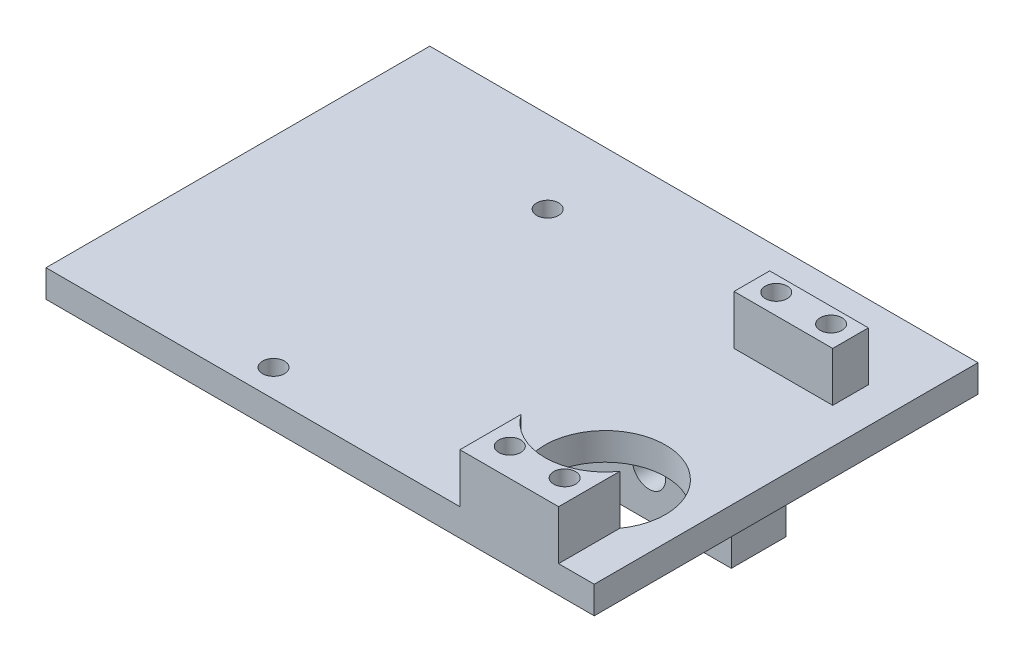
ISO-10303-21;
HEADER;
FILE_DESCRIPTION(('STEP AP214'),'2;1');
FILE_NAME('part.step','',(''),(''),'','','');
FILE_SCHEMA(('AUTOMOTIVE_DESIGN { 1 0 10303 214 1 1 1 1 }'));
ENDSEC;
DATA;
#1=APPLICATION_CONTEXT('core data for automotive mechanical design processes');
#2=APPLICATION_PROTOCOL_DEFINITION('international standard','automotive_design',2000,#1);
#3=PRODUCT_CONTEXT('',#1,'mechanical');
#4=PRODUCT('Part','Part','',(#3));
#5=PRODUCT_RELATED_PRODUCT_CATEGORY('part','',(#4));
#6=PRODUCT_DEFINITION_FORMATION('','',#4);
#7=PRODUCT_DEFINITION_CONTEXT('part definition',#1,'design');
#8=PRODUCT_DEFINITION('design','',#6,#7);
#9=PRODUCT_DEFINITION_SHAPE('','',#8);
#10=(LENGTH_UNIT() NAMED_UNIT(*) SI_UNIT(.MILLI.,.METRE.));
#11=(NAMED_UNIT(*) PLANE_ANGLE_UNIT() SI_UNIT($,.RADIAN.));
#12=(NAMED_UNIT(*) SI_UNIT($,.STERADIAN.) SOLID_ANGLE_UNIT());
#13=UNCERTAINTY_MEASURE_WITH_UNIT(LENGTH_MEASURE(1.E-05),#10,'distance_accuracy_value','');
#14=(GEOMETRIC_REPRESENTATION_CONTEXT(3) GLOBAL_UNCERTAINTY_ASSIGNED_CONTEXT((#13)) GLOBAL_UNIT_ASSIGNED_CONTEXT((#10,
#11,#12)) REPRESENTATION_CONTEXT('',''));
#15=CARTESIAN_POINT('',(0.,0.,0.));
#16=DIRECTION('',(0.,0.,1.));
#17=DIRECTION('',(1.,0.,0.));
#18=AXIS2_PLACEMENT_3D('',#15,#16,#17);
#19=CARTESIAN_POINT('',(0.,5.,0.));
#20=DIRECTION('',(0.,-1.,0.));
#21=DIRECTION('',(0.,0.,-1.));
#22=AXIS2_PLACEMENT_3D('',#19,#20,#21);
#23=PLANE('',#22);
#24=CARTESIAN_POINT('',(-13.5,5.,30.));
#25=DIRECTION('',(0.,1.,0.));
#26=DIRECTION('',(0.,0.,1.));
#27=AXIS2_PLACEMENT_3D('',#24,#25,#26);
#28=CIRCLE('',#27,2.);
#29=CARTESIAN_POINT('',(-13.5,5.,32.));
#30=VERTEX_POINT('',#29);
#31=EDGE_CURVE('E349',#30,#30,#28,.T.);
#32=ORIENTED_EDGE('',*,*,#31,.F.);
#33=EDGE_LOOP('',(#32));
#34=FACE_BOUND('',#33,.T.);
#35=CARTESIAN_POINT('',(-13.5,5.,-20.));
#36=DIRECTION('',(0.,1.,0.));
#37=DIRECTION('',(0.,0.,1.));
#38=AXIS2_PLACEMENT_3D('',#35,#36,#37);
#39=CIRCLE('',#38,2.);
#40=CARTESIAN_POINT('',(-13.5,5.,-18.));
#41=VERTEX_POINT('',#40);
#42=EDGE_CURVE('E346',#41,#41,#39,.T.);
#43=ORIENTED_EDGE('',*,*,#42,.F.);
#44=EDGE_LOOP('',(#43));
#45=FACE_BOUND('',#44,.T.);
#46=DIRECTION('',(0.,0.,1.));
#47=VECTOR('',#46,1.);
#48=CARTESIAN_POINT('',(25.5,5.,-21.5));
#49=LINE('',#48,#47);
#50=CARTESIAN_POINT('',(25.5,5.,-21.5));
#51=VERTEX_POINT('',#50);
#52=CARTESIAN_POINT('',(25.5,5.,-15.));
#53=VERTEX_POINT('',#52);
#54=EDGE_CURVE('E188',#51,#53,#49,.T.);
#55=ORIENTED_EDGE('',*,*,#54,.F.);
#56=DIRECTION('',(-1.,0.,0.));
#57=VECTOR('',#56,1.);
#58=CARTESIAN_POINT('',(25.5,5.,-21.5));
#59=LINE('',#58,#57);
#60=CARTESIAN_POINT('',(43.5,5.,-21.5));
#61=VERTEX_POINT('',#60);
#62=EDGE_CURVE('E215',#61,#51,#59,.T.);
#63=ORIENTED_EDGE('',*,*,#62,.F.);
#64=DIRECTION('',(0.,0.,-1.));
#65=VECTOR('',#64,1.);
#66=CARTESIAN_POINT('',(43.5,5.,-21.5));
#67=LINE('',#66,#65);
#68=CARTESIAN_POINT('',(43.5,5.,-15.));
#69=VERTEX_POINT('',#68);
#70=EDGE_CURVE('E218',#69,#61,#67,.T.);
#71=ORIENTED_EDGE('',*,*,#70,.F.);
#72=DIRECTION('',(1.,0.,0.));
#73=VECTOR('',#72,1.);
#74=CARTESIAN_POINT('',(25.5,5.,-15.));
#75=LINE('',#74,#73);
#76=EDGE_CURVE('E222',#53,#69,#75,.T.);
#77=ORIENTED_EDGE('',*,*,#76,.F.);
#78=EDGE_LOOP('',(#55,#63,#71,#77));
#79=FACE_BOUND('',#78,.T.);
#80=DIRECTION('',(0.,0.,1.));
#81=VECTOR('',#80,1.);
#82=CARTESIAN_POINT('',(25.5,5.,35.));
#83=LINE('',#82,#81);
#84=CARTESIAN_POINT('',(25.5,5.,23.8245553203368));
#85=VERTEX_POINT('',#84);
#86=CARTESIAN_POINT('',(25.5,5.,35.));
#87=VERTEX_POINT('',#86);
#88=EDGE_CURVE('E175',#85,#87,#83,.T.);
#89=ORIENTED_EDGE('',*,*,#88,.F.);
#90=CARTESIAN_POINT('',(34.5,5.,17.5));
#91=DIRECTION('',(0.,1.,0.));
#92=DIRECTION('',(0.,0.,1.));
#93=AXIS2_PLACEMENT_3D('',#90,#91,#92);
#94=CIRCLE('',#93,11.);
#95=CARTESIAN_POINT('',(43.5,5.,23.8245553203368));
#96=VERTEX_POINT('',#95);
#97=EDGE_CURVE('E237',#96,#85,#94,.T.);
#98=ORIENTED_EDGE('',*,*,#97,.F.);
#99=DIRECTION('',(0.,0.,-1.));
#100=VECTOR('',#99,1.);
#101=CARTESIAN_POINT('',(43.5,5.,23.8245553203368));
#102=LINE('',#101,#100);
#103=CARTESIAN_POINT('',(43.5,5.,35.));
#104=VERTEX_POINT('',#103);
#105=EDGE_CURVE('E185',#104,#96,#102,.T.);
#106=ORIENTED_EDGE('',*,*,#105,.F.);
#107=DIRECTION('',(1.,0.,0.));
#108=VECTOR('',#107,1.);
#109=CARTESIAN_POINT('',(50.,5.,35.));
#110=LINE('',#109,#108);
#111=CARTESIAN_POINT('',(50.,5.,35.));
#112=VERTEX_POINT('',#111);
#113=EDGE_CURVE('E246',#104,#112,#110,.T.);
#114=ORIENTED_EDGE('',*,*,#113,.T.);
#115=DIRECTION('',(0.,0.,-1.));
#116=VECTOR('',#115,1.);
#117=CARTESIAN_POINT('',(50.,5.,-35.));
#118=LINE('',#117,#116);
#119=CARTESIAN_POINT('',(50.,5.,-35.));
#120=VERTEX_POINT('',#119);
#121=EDGE_CURVE('E251',#112,#120,#118,.T.);
#122=ORIENTED_EDGE('',*,*,#121,.T.);
#123=DIRECTION('',(-1.,0.,0.));
#124=VECTOR('',#123,1.);
#125=CARTESIAN_POINT('',(50.,5.,-35.));
#126=LINE('',#125,#124);
#127=CARTESIAN_POINT('',(-50.,5.,-35.));
#128=VERTEX_POINT('',#127);
#129=EDGE_CURVE('E254',#120,#128,#126,.T.);
#130=ORIENTED_EDGE('',*,*,#129,.T.);
#131=DIRECTION('',(0.,0.,1.));
#132=VECTOR('',#131,1.);
#133=CARTESIAN_POINT('',(-50.,5.,-35.));
#134=LINE('',#133,#132);
#135=CARTESIAN_POINT('',(-50.,5.,35.));
#136=VERTEX_POINT('',#135);
#137=EDGE_CURVE('E243',#128,#136,#134,.T.);
#138=ORIENTED_EDGE('',*,*,#137,.T.);
#139=EDGE_CURVE('E248',#136,#87,#110,.T.);
#140=ORIENTED_EDGE('',*,*,#139,.T.);
#141=EDGE_LOOP('',(#89,#98,#106,#114,#122,#130,#138,#140));
#142=FACE_BOUND('',#141,.T.);
#143=ADVANCED_FACE('F41',(#34,#45,#79,#142),#23,.F.);
#144=CARTESIAN_POINT('',(0.,0.,0.));
#145=DIRECTION('',(0.,-1.,0.));
#146=DIRECTION('',(0.,0.,-1.));
#147=AXIS2_PLACEMENT_3D('',#144,#145,#146);
#148=PLANE('',#147);
#149=CARTESIAN_POINT('',(-13.5,0.,30.));
#150=DIRECTION('',(0.,-1.,0.));
#151=DIRECTION('',(0.,0.,-1.));
#152=AXIS2_PLACEMENT_3D('',#149,#150,#151);
#153=CIRCLE('',#152,2.);
#154=CARTESIAN_POINT('',(-13.5,0.,28.));
#155=VERTEX_POINT('',#154);
#156=EDGE_CURVE('E324',#155,#155,#153,.F.);
#157=ORIENTED_EDGE('',*,*,#156,.T.);
#158=EDGE_LOOP('',(#157));
#159=FACE_BOUND('',#158,.T.);
#160=DIRECTION('',(-1.,0.,0.));
#161=VECTOR('',#160,1.);
#162=CARTESIAN_POINT('',(0.,0.,-22.));
#163=LINE('',#162,#161);
#164=CARTESIAN_POINT('',(-50.,0.,-22.));
#165=VERTEX_POINT('',#164);
#166=CARTESIAN_POINT('',(-13.5,0.,-22.));
#167=VERTEX_POINT('',#166);
#168=EDGE_CURVE('E275',#165,#167,#163,.F.);
#169=ORIENTED_EDGE('',*,*,#168,.T.);
#170=CARTESIAN_POINT('',(-13.5,0.,-20.));
#171=DIRECTION('',(0.,-1.,0.));
#172=DIRECTION('',(0.,0.,-1.));
#173=AXIS2_PLACEMENT_3D('',#170,#171,#172);
#174=CIRCLE('',#173,2.);
#175=EDGE_CURVE('E54',#167,#167,#174,.F.);
#176=ORIENTED_EDGE('',*,*,#175,.T.);
#177=CARTESIAN_POINT('',(50.,0.,-22.));
#178=VERTEX_POINT('',#177);
#179=EDGE_CURVE('E75',#167,#178,#163,.F.);
#180=ORIENTED_EDGE('',*,*,#179,.T.);
#181=DIRECTION('',(0.,0.,-1.));
#182=VECTOR('',#181,1.);
#183=CARTESIAN_POINT('',(50.,0.,-35.));
#184=LINE('',#183,#182);
#185=CARTESIAN_POINT('',(50.,0.,35.));
#186=VERTEX_POINT('',#185);
#187=EDGE_CURVE('E247',#186,#178,#184,.T.);
#188=ORIENTED_EDGE('',*,*,#187,.F.);
#189=DIRECTION('',(1.,0.,0.));
#190=VECTOR('',#189,1.);
#191=CARTESIAN_POINT('',(50.,0.,35.));
#192=LINE('',#191,#190);
#193=CARTESIAN_POINT('',(-50.,0.,35.));
#194=VERTEX_POINT('',#193);
#195=EDGE_CURVE('E259',#194,#186,#192,.T.);
#196=ORIENTED_EDGE('',*,*,#195,.F.);
#197=DIRECTION('',(0.,0.,1.));
#198=VECTOR('',#197,1.);
#199=CARTESIAN_POINT('',(-50.,0.,-35.));
#200=LINE('',#199,#198);
#201=EDGE_CURVE('E240',#165,#194,#200,.T.);
#202=ORIENTED_EDGE('',*,*,#201,.F.);
#203=EDGE_LOOP('',(#169,#176,#180,#188,#196,#202));
#204=FACE_BOUND('',#203,.T.);
#205=CARTESIAN_POINT('',(34.5,0.,17.5));
#206=DIRECTION('',(0.,1.,0.));
#207=DIRECTION('',(0.,0.,1.));
#208=AXIS2_PLACEMENT_3D('',#205,#206,#207);
#209=CIRCLE('',#208,11.);
#210=CARTESIAN_POINT('',(34.5,0.,28.5));
#211=VERTEX_POINT('',#210);
#212=EDGE_CURVE('E202',#211,#211,#209,.T.);
#213=ORIENTED_EDGE('',*,*,#212,.T.);
#214=EDGE_LOOP('',(#213));
#215=FACE_BOUND('',#214,.T.);
#216=ADVANCED_FACE('F361',(#159,#204,#215),#148,.T.);
#217=CARTESIAN_POINT('',(-50.,5.,-35.));
#218=DIRECTION('',(1.,0.,0.));
#219=DIRECTION('',(0.,0.,-1.));
#220=AXIS2_PLACEMENT_3D('',#217,#218,#219);
#221=PLANE('',#220);
#222=CARTESIAN_POINT('',(-50.,0.,-35.));
#223=VERTEX_POINT('',#222);
#224=EDGE_CURVE('E62',#223,#165,#200,.T.);
#225=ORIENTED_EDGE('',*,*,#224,.T.);
#226=ORIENTED_EDGE('',*,*,#201,.T.);
#227=DIRECTION('',(0.,-1.,0.));
#228=VECTOR('',#227,1.);
#229=CARTESIAN_POINT('',(-50.,5.,35.));
#230=LINE('',#229,#228);
#231=EDGE_CURVE('E269',#136,#194,#230,.T.);
#232=ORIENTED_EDGE('',*,*,#231,.F.);
#233=ORIENTED_EDGE('',*,*,#137,.F.);
#234=DIRECTION('',(0.,-1.,0.));
#235=VECTOR('',#234,1.);
#236=CARTESIAN_POINT('',(-50.,5.,-35.));
#237=LINE('',#236,#235);
#238=EDGE_CURVE('E257',#128,#223,#237,.T.);
#239=ORIENTED_EDGE('',*,*,#238,.T.);
#240=EDGE_LOOP('',(#225,#226,#232,#233,#239));
#241=FACE_BOUND('',#240,.T.);
#242=ADVANCED_FACE('F542',(#241),#221,.F.);
#243=CARTESIAN_POINT('',(50.,5.,35.));
#244=DIRECTION('',(0.,0.,-1.));
#245=DIRECTION('',(-1.,0.,0.));
#246=AXIS2_PLACEMENT_3D('',#243,#244,#245);
#247=PLANE('',#246);
#248=ORIENTED_EDGE('',*,*,#195,.T.);
#249=DIRECTION('',(0.,-1.,0.));
#250=VECTOR('',#249,1.);
#251=CARTESIAN_POINT('',(50.,5.,35.));
#252=LINE('',#251,#250);
#253=EDGE_CURVE('E266',#112,#186,#252,.T.);
#254=ORIENTED_EDGE('',*,*,#253,.F.);
#255=ORIENTED_EDGE('',*,*,#113,.F.);
#256=DIRECTION('',(0.,-1.,0.));
#257=VECTOR('',#256,1.);
#258=CARTESIAN_POINT('',(43.5,14.,35.));
#259=LINE('',#258,#257);
#260=CARTESIAN_POINT('',(43.5,14.,35.));
#261=VERTEX_POINT('',#260);
#262=EDGE_CURVE('E199',#261,#104,#259,.T.);
#263=ORIENTED_EDGE('',*,*,#262,.F.);
#264=DIRECTION('',(1.,0.,0.));
#265=VECTOR('',#264,1.);
#266=CARTESIAN_POINT('',(25.5,14.,35.));
#267=LINE('',#266,#265);
#268=CARTESIAN_POINT('',(25.5,14.,35.));
#269=VERTEX_POINT('',#268);
#270=EDGE_CURVE('E171',#269,#261,#267,.T.);
#271=ORIENTED_EDGE('',*,*,#270,.F.);
#272=DIRECTION('',(0.,-1.,0.));
#273=VECTOR('',#272,1.);
#274=CARTESIAN_POINT('',(25.5,14.,35.));
#275=LINE('',#274,#273);
#276=EDGE_CURVE('E184',#269,#87,#275,.T.);
#277=ORIENTED_EDGE('',*,*,#276,.T.);
#278=ORIENTED_EDGE('',*,*,#139,.F.);
#279=ORIENTED_EDGE('',*,*,#231,.T.);
#280=EDGE_LOOP('',(#248,#254,#255,#263,#271,#277,#278,#279));
#281=FACE_BOUND('',#280,.T.);
#282=ADVANCED_FACE('F549',(#281),#247,.F.);
#283=CARTESIAN_POINT('',(50.,5.,-35.));
#284=DIRECTION('',(-1.,0.,0.));
#285=DIRECTION('',(0.,0.,1.));
#286=AXIS2_PLACEMENT_3D('',#283,#284,#285);
#287=PLANE('',#286);
#288=ORIENTED_EDGE('',*,*,#187,.T.);
#289=DIRECTION('',(0.,0.,-1.));
#290=VECTOR('',#289,1.);
#291=CARTESIAN_POINT('',(50.,0.,-25.));
#292=LINE('',#291,#290);
#293=CARTESIAN_POINT('',(50.,0.,-35.));
#294=VERTEX_POINT('',#293);
#295=EDGE_CURVE('E137',#178,#294,#292,.T.);
#296=ORIENTED_EDGE('',*,*,#295,.T.);
#297=DIRECTION('',(0.,-1.,0.));
#298=VECTOR('',#297,1.);
#299=CARTESIAN_POINT('',(50.,5.,-35.));
#300=LINE('',#299,#298);
#301=EDGE_CURVE('E125',#120,#294,#300,.T.);
#302=ORIENTED_EDGE('',*,*,#301,.F.);
#303=ORIENTED_EDGE('',*,*,#121,.F.);
#304=ORIENTED_EDGE('',*,*,#253,.T.);
#305=EDGE_LOOP('',(#288,#296,#302,#303,#304));
#306=FACE_BOUND('',#305,.T.);
#307=ADVANCED_FACE('F546',(#306),#287,.F.);
#308=CARTESIAN_POINT('',(50.,5.,-35.));
#309=DIRECTION('',(0.,0.,1.));
#310=DIRECTION('',(1.,0.,0.));
#311=AXIS2_PLACEMENT_3D('',#308,#309,#310);
#312=PLANE('',#311);
#313=ORIENTED_EDGE('',*,*,#301,.T.);
#314=DIRECTION('',(-0.98058067569092,-0.196116135138184,0.));
#315=VECTOR('',#314,1.);
#316=CARTESIAN_POINT('',(1.92307692307692,-9.61538461538462,-35.));
#317=LINE('',#316,#315);
#318=CARTESIAN_POINT('',(17.4116515945855,-6.51766968108291,-35.));
#319=VERTEX_POINT('',#318);
#320=EDGE_CURVE('E114',#294,#319,#317,.T.);
#321=ORIENTED_EDGE('',*,*,#320,.T.);
#322=CARTESIAN_POINT('',(18.,-9.45941170815567,-35.));
#323=DIRECTION('',(0.,0.,1.));
#324=DIRECTION('',(1.,0.,0.));
#325=AXIS2_PLACEMENT_3D('',#322,#323,#324);
#326=CIRCLE('',#325,3.);
#327=CARTESIAN_POINT('',(15.,-9.45941170815567,-35.));
#328=VERTEX_POINT('',#327);
#329=EDGE_CURVE('E49',#319,#328,#326,.T.);
#330=ORIENTED_EDGE('',*,*,#329,.T.);
#331=DIRECTION('',(0.,1.,0.));
#332=VECTOR('',#331,1.);
#333=CARTESIAN_POINT('',(15.,0.,-35.));
#334=LINE('',#333,#332);
#335=CARTESIAN_POINT('',(15.,-40.,-35.));
#336=VERTEX_POINT('',#335);
#337=EDGE_CURVE('E327',#336,#328,#334,.T.);
#338=ORIENTED_EDGE('',*,*,#337,.F.);
#339=DIRECTION('',(1.,0.,0.));
#340=VECTOR('',#339,1.);
#341=CARTESIAN_POINT('',(0.,-40.,-35.));
#342=LINE('',#341,#340);
#343=CARTESIAN_POINT('',(-15.,-40.,-35.));
#344=VERTEX_POINT('',#343);
#345=EDGE_CURVE('E329',#344,#336,#342,.T.);
#346=ORIENTED_EDGE('',*,*,#345,.F.);
#347=DIRECTION('',(0.,1.,0.));
#348=VECTOR('',#347,1.);
#349=CARTESIAN_POINT('',(-15.,0.,-35.));
#350=LINE('',#349,#348);
#351=CARTESIAN_POINT('',(-15.,-9.45941170815567,-35.));
#352=VERTEX_POINT('',#351);
#353=EDGE_CURVE('E133',#344,#352,#350,.T.);
#354=ORIENTED_EDGE('',*,*,#353,.T.);
#355=CARTESIAN_POINT('',(-18.,-9.45941170815567,-35.));
#356=DIRECTION('',(0.,0.,1.));
#357=DIRECTION('',(1.,0.,0.));
#358=AXIS2_PLACEMENT_3D('',#355,#356,#357);
#359=CIRCLE('',#358,3.);
#360=CARTESIAN_POINT('',(-17.4116515945854,-6.51766968108291,-35.));
#361=VERTEX_POINT('',#360);
#362=EDGE_CURVE('E288',#352,#361,#359,.T.);
#363=ORIENTED_EDGE('',*,*,#362,.T.);
#364=DIRECTION('',(0.98058067569092,-0.196116135138184,0.));
#365=VECTOR('',#364,1.);
#366=CARTESIAN_POINT('',(-1.92307692307693,-9.61538461538461,-35.));
#367=LINE('',#366,#365);
#368=EDGE_CURVE('E127',#223,#361,#367,.T.);
#369=ORIENTED_EDGE('',*,*,#368,.F.);
#370=ORIENTED_EDGE('',*,*,#238,.F.);
#371=ORIENTED_EDGE('',*,*,#129,.F.);
#372=EDGE_LOOP('',(#313,#321,#330,#338,#346,#354,#363,#369,#370,#371));
#373=FACE_BOUND('',#372,.T.);
#374=CARTESIAN_POINT('',(0.,-32.,-35.));
#375=DIRECTION('',(0.,0.,-1.));
#376=DIRECTION('',(-1.,0.,0.));
#377=AXIS2_PLACEMENT_3D('',#374,#375,#376);
#378=CIRCLE('',#377,3.);
#379=CARTESIAN_POINT('',(-3.,-32.,-35.));
#380=VERTEX_POINT('',#379);
#381=EDGE_CURVE('E320',#380,#380,#378,.T.);
#382=ORIENTED_EDGE('',*,*,#381,.F.);
#383=EDGE_LOOP('',(#382));
#384=FACE_BOUND('',#383,.T.);
#385=CARTESIAN_POINT('',(0.,-8.,-35.));
#386=DIRECTION('',(0.,0.,-1.));
#387=DIRECTION('',(-1.,0.,0.));
#388=AXIS2_PLACEMENT_3D('',#385,#386,#387);
#389=CIRCLE('',#388,3.);
#390=CARTESIAN_POINT('',(-3.,-8.,-35.));
#391=VERTEX_POINT('',#390);
#392=EDGE_CURVE('E323',#391,#391,#389,.T.);
#393=ORIENTED_EDGE('',*,*,#392,.F.);
#394=EDGE_LOOP('',(#393));
#395=FACE_BOUND('',#394,.T.);
#396=ADVANCED_FACE('F121',(#373,#384,#395),#312,.F.);
#397=CARTESIAN_POINT('',(34.5,5.,17.5));
#398=DIRECTION('',(0.,-1.,0.));
#399=DIRECTION('',(0.,0.,-1.));
#400=AXIS2_PLACEMENT_3D('',#397,#398,#399);
#401=CYLINDRICAL_SURFACE('',#400,11.);
#402=ORIENTED_EDGE('',*,*,#97,.T.);
#403=DIRECTION('',(0.,-1.,0.));
#404=VECTOR('',#403,1.);
#405=CARTESIAN_POINT('',(25.5,14.,23.8245553203368));
#406=LINE('',#405,#404);
#407=CARTESIAN_POINT('',(25.5,14.,23.8245553203368));
#408=VERTEX_POINT('',#407);
#409=EDGE_CURVE('E193',#408,#85,#406,.T.);
#410=ORIENTED_EDGE('',*,*,#409,.F.);
#411=CARTESIAN_POINT('',(34.5,14.,17.5));
#412=DIRECTION('',(0.,-1.,0.));
#413=DIRECTION('',(0.,0.,1.));
#414=AXIS2_PLACEMENT_3D('',#411,#412,#413);
#415=CIRCLE('',#414,11.);
#416=CARTESIAN_POINT('',(43.5,14.,23.8245553203368));
#417=VERTEX_POINT('',#416);
#418=EDGE_CURVE('E178',#417,#408,#415,.T.);
#419=ORIENTED_EDGE('',*,*,#418,.F.);
#420=DIRECTION('',(0.,-1.,0.));
#421=VECTOR('',#420,1.);
#422=CARTESIAN_POINT('',(43.5,14.,23.8245553203368));
#423=LINE('',#422,#421);
#424=EDGE_CURVE('E196',#417,#96,#423,.T.);
#425=ORIENTED_EDGE('',*,*,#424,.T.);
#426=EDGE_LOOP('',(#402,#410,#419,#425));
#427=FACE_BOUND('',#426,.T.);
#428=ORIENTED_EDGE('',*,*,#212,.F.);
#429=EDGE_LOOP('',(#428));
#430=FACE_BOUND('',#429,.T.);
#431=ADVANCED_FACE('F384',(#427,#430),#401,.F.);
#432=CARTESIAN_POINT('',(25.5,14.,-21.5));
#433=DIRECTION('',(1.,0.,0.));
#434=DIRECTION('',(0.,0.,-1.));
#435=AXIS2_PLACEMENT_3D('',#432,#433,#434);
#436=PLANE('',#435);
#437=ORIENTED_EDGE('',*,*,#54,.T.);
#438=DIRECTION('',(0.,-1.,0.));
#439=VECTOR('',#438,1.);
#440=CARTESIAN_POINT('',(25.5,14.,-15.));
#441=LINE('',#440,#439);
#442=CARTESIAN_POINT('',(25.5,14.,-15.));
#443=VERTEX_POINT('',#442);
#444=EDGE_CURVE('E168',#443,#53,#441,.T.);
#445=ORIENTED_EDGE('',*,*,#444,.F.);
#446=DIRECTION('',(0.,0.,1.));
#447=VECTOR('',#446,1.);
#448=CARTESIAN_POINT('',(25.5,14.,-21.5));
#449=LINE('',#448,#447);
#450=CARTESIAN_POINT('',(25.5,14.,-21.5));
#451=VERTEX_POINT('',#450);
#452=EDGE_CURVE('E219',#451,#443,#449,.T.);
#453=ORIENTED_EDGE('',*,*,#452,.F.);
#454=DIRECTION('',(0.,-1.,0.));
#455=VECTOR('',#454,1.);
#456=CARTESIAN_POINT('',(25.5,14.,-21.5));
#457=LINE('',#456,#455);
#458=EDGE_CURVE('E211',#451,#51,#457,.T.);
#459=ORIENTED_EDGE('',*,*,#458,.T.);
#460=EDGE_LOOP('',(#437,#445,#453,#459));
#461=FACE_BOUND('',#460,.T.);
#462=ADVANCED_FACE('F519',(#461),#436,.F.);
#463=CARTESIAN_POINT('',(25.5,14.,-15.));
#464=DIRECTION('',(0.,0.,-1.));
#465=DIRECTION('',(-1.,0.,0.));
#466=AXIS2_PLACEMENT_3D('',#463,#464,#465);
#467=PLANE('',#466);
#468=ORIENTED_EDGE('',*,*,#76,.T.);
#469=DIRECTION('',(0.,-1.,0.));
#470=VECTOR('',#469,1.);
#471=CARTESIAN_POINT('',(43.5,14.,-15.));
#472=LINE('',#471,#470);
#473=CARTESIAN_POINT('',(43.5,14.,-15.));
#474=VERTEX_POINT('',#473);
#475=EDGE_CURVE('E205',#474,#69,#472,.T.);
#476=ORIENTED_EDGE('',*,*,#475,.F.);
#477=DIRECTION('',(1.,0.,0.));
#478=VECTOR('',#477,1.);
#479=CARTESIAN_POINT('',(25.5,14.,-15.));
#480=LINE('',#479,#478);
#481=EDGE_CURVE('E232',#443,#474,#480,.T.);
#482=ORIENTED_EDGE('',*,*,#481,.F.);
#483=ORIENTED_EDGE('',*,*,#444,.T.);
#484=EDGE_LOOP('',(#468,#476,#482,#483));
#485=FACE_BOUND('',#484,.T.);
#486=ADVANCED_FACE('F522',(#485),#467,.F.);
#487=CARTESIAN_POINT('',(43.5,14.,-21.5));
#488=DIRECTION('',(-1.,0.,0.));
#489=DIRECTION('',(0.,0.,1.));
#490=AXIS2_PLACEMENT_3D('',#487,#488,#489);
#491=PLANE('',#490);
#492=ORIENTED_EDGE('',*,*,#70,.T.);
#493=DIRECTION('',(0.,-1.,0.));
#494=VECTOR('',#493,1.);
#495=CARTESIAN_POINT('',(43.5,14.,-21.5));
#496=LINE('',#495,#494);
#497=CARTESIAN_POINT('',(43.5,14.,-21.5));
#498=VERTEX_POINT('',#497);
#499=EDGE_CURVE('E208',#498,#61,#496,.T.);
#500=ORIENTED_EDGE('',*,*,#499,.F.);
#501=DIRECTION('',(0.,0.,-1.));
#502=VECTOR('',#501,1.);
#503=CARTESIAN_POINT('',(43.5,14.,-21.5));
#504=LINE('',#503,#502);
#505=EDGE_CURVE('E229',#474,#498,#504,.T.);
#506=ORIENTED_EDGE('',*,*,#505,.F.);
#507=ORIENTED_EDGE('',*,*,#475,.T.);
#508=EDGE_LOOP('',(#492,#500,#506,#507));
#509=FACE_BOUND('',#508,.T.);
#510=ADVANCED_FACE('F526',(#509),#491,.F.);
#511=CARTESIAN_POINT('',(25.5,14.,-21.5));
#512=DIRECTION('',(0.,0.,1.));
#513=DIRECTION('',(1.,0.,0.));
#514=AXIS2_PLACEMENT_3D('',#511,#512,#513);
#515=PLANE('',#514);
#516=ORIENTED_EDGE('',*,*,#62,.T.);
#517=ORIENTED_EDGE('',*,*,#458,.F.);
#518=DIRECTION('',(-1.,0.,0.));
#519=VECTOR('',#518,1.);
#520=CARTESIAN_POINT('',(25.5,14.,-21.5));
#521=LINE('',#520,#519);
#522=EDGE_CURVE('E214',#498,#451,#521,.T.);
#523=ORIENTED_EDGE('',*,*,#522,.F.);
#524=ORIENTED_EDGE('',*,*,#499,.T.);
#525=EDGE_LOOP('',(#516,#517,#523,#524));
#526=FACE_BOUND('',#525,.T.);
#527=ADVANCED_FACE('F530',(#526),#515,.F.);
#528=CARTESIAN_POINT('',(0.,14.,0.));
#529=DIRECTION('',(0.,1.,0.));
#530=DIRECTION('',(0.,0.,1.));
#531=AXIS2_PLACEMENT_3D('',#528,#529,#530);
#532=PLANE('',#531);
#533=CARTESIAN_POINT('',(29.5,14.,-18.7));
#534=DIRECTION('',(0.,1.,0.));
#535=DIRECTION('',(0.,0.,1.));
#536=AXIS2_PLACEMENT_3D('',#533,#534,#535);
#537=CIRCLE('',#536,2.);
#538=CARTESIAN_POINT('',(29.5,14.,-16.7));
#539=VERTEX_POINT('',#538);
#540=EDGE_CURVE('E160',#539,#539,#537,.T.);
#541=ORIENTED_EDGE('',*,*,#540,.F.);
#542=EDGE_LOOP('',(#541));
#543=FACE_BOUND('',#542,.T.);
#544=CARTESIAN_POINT('',(39.5,14.,-18.7));
#545=DIRECTION('',(0.,1.,0.));
#546=DIRECTION('',(0.,0.,1.));
#547=AXIS2_PLACEMENT_3D('',#544,#545,#546);
#548=CIRCLE('',#547,2.);
#549=CARTESIAN_POINT('',(39.5,14.,-16.7));
#550=VERTEX_POINT('',#549);
#551=EDGE_CURVE('E154',#550,#550,#548,.T.);
#552=ORIENTED_EDGE('',*,*,#551,.F.);
#553=EDGE_LOOP('',(#552));
#554=FACE_BOUND('',#553,.T.);
#555=ORIENTED_EDGE('',*,*,#452,.T.);
#556=ORIENTED_EDGE('',*,*,#481,.T.);
#557=ORIENTED_EDGE('',*,*,#505,.T.);
#558=ORIENTED_EDGE('',*,*,#522,.T.);
#559=EDGE_LOOP('',(#555,#556,#557,#558));
#560=FACE_BOUND('',#559,.T.);
#561=ADVANCED_FACE('F517',(#543,#554,#560),#532,.T.);
#562=CARTESIAN_POINT('',(43.5,14.,23.8245553203368));
#563=DIRECTION('',(-1.,0.,0.));
#564=DIRECTION('',(0.,0.,1.));
#565=AXIS2_PLACEMENT_3D('',#562,#563,#564);
#566=PLANE('',#565);
#567=ORIENTED_EDGE('',*,*,#105,.T.);
#568=ORIENTED_EDGE('',*,*,#424,.F.);
#569=DIRECTION('',(0.,0.,-1.));
#570=VECTOR('',#569,1.);
#571=CARTESIAN_POINT('',(43.5,14.,23.8245553203368));
#572=LINE('',#571,#570);
#573=EDGE_CURVE('E174',#261,#417,#572,.T.);
#574=ORIENTED_EDGE('',*,*,#573,.F.);
#575=ORIENTED_EDGE('',*,*,#262,.T.);
#576=EDGE_LOOP('',(#567,#568,#574,#575));
#577=FACE_BOUND('',#576,.T.);
#578=ADVANCED_FACE('F514',(#577),#566,.F.);
#579=CARTESIAN_POINT('',(25.5,14.,35.));
#580=DIRECTION('',(1.,0.,0.));
#581=DIRECTION('',(0.,0.,-1.));
#582=AXIS2_PLACEMENT_3D('',#579,#580,#581);
#583=PLANE('',#582);
#584=ORIENTED_EDGE('',*,*,#88,.T.);
#585=ORIENTED_EDGE('',*,*,#276,.F.);
#586=DIRECTION('',(0.,0.,1.));
#587=VECTOR('',#586,1.);
#588=CARTESIAN_POINT('',(25.5,14.,35.));
#589=LINE('',#588,#587);
#590=EDGE_CURVE('E181',#408,#269,#589,.T.);
#591=ORIENTED_EDGE('',*,*,#590,.F.);
#592=ORIENTED_EDGE('',*,*,#409,.T.);
#593=EDGE_LOOP('',(#584,#585,#591,#592));
#594=FACE_BOUND('',#593,.T.);
#595=ADVANCED_FACE('F390',(#594),#583,.F.);
#596=CARTESIAN_POINT('',(34.5,14.,17.5));
#597=DIRECTION('',(0.,1.,0.));
#598=DIRECTION('',(0.,0.,1.));
#599=AXIS2_PLACEMENT_3D('',#596,#597,#598);
#600=PLANE('',#599);
#601=CARTESIAN_POINT('',(39.5,14.,29.9));
#602=DIRECTION('',(0.,1.,0.));
#603=DIRECTION('',(0.,0.,1.));
#604=AXIS2_PLACEMENT_3D('',#601,#602,#603);
#605=CIRCLE('',#604,2.);
#606=CARTESIAN_POINT('',(39.5,14.,31.9));
#607=VERTEX_POINT('',#606);
#608=EDGE_CURVE('E147',#607,#607,#605,.T.);
#609=ORIENTED_EDGE('',*,*,#608,.F.);
#610=EDGE_LOOP('',(#609));
#611=FACE_BOUND('',#610,.T.);
#612=CARTESIAN_POINT('',(29.5,14.,29.9));
#613=DIRECTION('',(0.,1.,0.));
#614=DIRECTION('',(0.,0.,1.));
#615=AXIS2_PLACEMENT_3D('',#612,#613,#614);
#616=CIRCLE('',#615,2.);
#617=CARTESIAN_POINT('',(29.5,14.,31.9));
#618=VERTEX_POINT('',#617);
#619=EDGE_CURVE('E150',#618,#618,#616,.T.);
#620=ORIENTED_EDGE('',*,*,#619,.F.);
#621=EDGE_LOOP('',(#620));
#622=FACE_BOUND('',#621,.T.);
#623=ORIENTED_EDGE('',*,*,#270,.T.);
#624=ORIENTED_EDGE('',*,*,#573,.T.);
#625=ORIENTED_EDGE('',*,*,#418,.T.);
#626=ORIENTED_EDGE('',*,*,#590,.T.);
#627=EDGE_LOOP('',(#623,#624,#625,#626));
#628=FACE_BOUND('',#627,.T.);
#629=ADVANCED_FACE('F396',(#611,#622,#628),#600,.T.);
#630=CARTESIAN_POINT('',(29.5,11.,29.9));
#631=DIRECTION('',(0.,1.,0.));
#632=DIRECTION('',(0.,0.,1.));
#633=AXIS2_PLACEMENT_3D('',#630,#631,#632);
#634=CYLINDRICAL_SURFACE('',#633,2.);
#635=CARTESIAN_POINT('',(29.5,11.,29.9));
#636=DIRECTION('',(0.,1.,0.));
#637=DIRECTION('',(0.,0.,1.));
#638=AXIS2_PLACEMENT_3D('',#635,#636,#637);
#639=CIRCLE('',#638,2.);
#640=CARTESIAN_POINT('',(29.5,11.,31.9));
#641=VERTEX_POINT('',#640);
#642=EDGE_CURVE('E165',#641,#641,#639,.T.);
#643=ORIENTED_EDGE('',*,*,#642,.F.);
#644=EDGE_LOOP('',(#643));
#645=FACE_BOUND('',#644,.T.);
#646=ORIENTED_EDGE('',*,*,#619,.T.);
#647=EDGE_LOOP('',(#646));
#648=FACE_BOUND('',#647,.T.);
#649=ADVANCED_FACE('F504',(#645,#648),#634,.F.);
#650=CARTESIAN_POINT('',(29.5,11.,29.9));
#651=DIRECTION('',(0.,1.,0.));
#652=DIRECTION('',(0.,0.,1.));
#653=AXIS2_PLACEMENT_3D('',#650,#651,#652);
#654=PLANE('',#653);
#655=ORIENTED_EDGE('',*,*,#642,.T.);
#656=EDGE_LOOP('',(#655));
#657=FACE_BOUND('',#656,.T.);
#658=ADVANCED_FACE('F482',(#657),#654,.T.);
#659=CARTESIAN_POINT('',(39.5,11.,29.9));
#660=DIRECTION('',(0.,1.,0.));
#661=DIRECTION('',(0.,0.,1.));
#662=AXIS2_PLACEMENT_3D('',#659,#660,#661);
#663=CYLINDRICAL_SURFACE('',#662,2.);
#664=CARTESIAN_POINT('',(39.5,11.,29.9));
#665=DIRECTION('',(0.,1.,0.));
#666=DIRECTION('',(0.,0.,1.));
#667=AXIS2_PLACEMENT_3D('',#664,#665,#666);
#668=CIRCLE('',#667,2.);
#669=CARTESIAN_POINT('',(39.5,11.,31.9));
#670=VERTEX_POINT('',#669);
#671=EDGE_CURVE('E151',#670,#670,#668,.T.);
#672=ORIENTED_EDGE('',*,*,#671,.F.);
#673=EDGE_LOOP('',(#672));
#674=FACE_BOUND('',#673,.T.);
#675=ORIENTED_EDGE('',*,*,#608,.T.);
#676=EDGE_LOOP('',(#675));
#677=FACE_BOUND('',#676,.T.);
#678=ADVANCED_FACE('F478',(#674,#677),#663,.F.);
#679=CARTESIAN_POINT('',(39.5,11.,29.9));
#680=DIRECTION('',(0.,1.,0.));
#681=DIRECTION('',(0.,0.,1.));
#682=AXIS2_PLACEMENT_3D('',#679,#680,#681);
#683=PLANE('',#682);
#684=ORIENTED_EDGE('',*,*,#671,.T.);
#685=EDGE_LOOP('',(#684));
#686=FACE_BOUND('',#685,.T.);
#687=ADVANCED_FACE('F481',(#686),#683,.T.);
#688=CARTESIAN_POINT('',(39.5,11.,-18.7));
#689=DIRECTION('',(0.,1.,0.));
#690=DIRECTION('',(0.,0.,1.));
#691=AXIS2_PLACEMENT_3D('',#688,#689,#690);
#692=CYLINDRICAL_SURFACE('',#691,2.);
#693=CARTESIAN_POINT('',(39.5,11.,-18.7));
#694=DIRECTION('',(0.,1.,0.));
#695=DIRECTION('',(0.,0.,1.));
#696=AXIS2_PLACEMENT_3D('',#693,#694,#695);
#697=CIRCLE('',#696,2.);
#698=CARTESIAN_POINT('',(39.5,11.,-16.7));
#699=VERTEX_POINT('',#698);
#700=EDGE_CURVE('E157',#699,#699,#697,.T.);
#701=ORIENTED_EDGE('',*,*,#700,.F.);
#702=EDGE_LOOP('',(#701));
#703=FACE_BOUND('',#702,.T.);
#704=ORIENTED_EDGE('',*,*,#551,.T.);
#705=EDGE_LOOP('',(#704));
#706=FACE_BOUND('',#705,.T.);
#707=ADVANCED_FACE('F486',(#703,#706),#692,.F.);
#708=CARTESIAN_POINT('',(39.5,11.,-18.7));
#709=DIRECTION('',(0.,1.,0.));
#710=DIRECTION('',(0.,0.,1.));
#711=AXIS2_PLACEMENT_3D('',#708,#709,#710);
#712=PLANE('',#711);
#713=ORIENTED_EDGE('',*,*,#700,.T.);
#714=EDGE_LOOP('',(#713));
#715=FACE_BOUND('',#714,.T.);
#716=ADVANCED_FACE('F490',(#715),#712,.T.);
#717=CARTESIAN_POINT('',(29.5,11.,-18.7));
#718=DIRECTION('',(0.,1.,0.));
#719=DIRECTION('',(0.,0.,1.));
#720=AXIS2_PLACEMENT_3D('',#717,#718,#719);
#721=CYLINDRICAL_SURFACE('',#720,2.);
#722=CARTESIAN_POINT('',(29.5,11.,-18.7));
#723=DIRECTION('',(0.,1.,0.));
#724=DIRECTION('',(0.,0.,1.));
#725=AXIS2_PLACEMENT_3D('',#722,#723,#724);
#726=CIRCLE('',#725,2.);
#727=CARTESIAN_POINT('',(29.5,11.,-16.7));
#728=VERTEX_POINT('',#727);
#729=EDGE_CURVE('E140',#728,#728,#726,.T.);
#730=ORIENTED_EDGE('',*,*,#729,.F.);
#731=EDGE_LOOP('',(#730));
#732=FACE_BOUND('',#731,.T.);
#733=ORIENTED_EDGE('',*,*,#540,.T.);
#734=EDGE_LOOP('',(#733));
#735=FACE_BOUND('',#734,.T.);
#736=ADVANCED_FACE('F494',(#732,#735),#721,.F.);
#737=CARTESIAN_POINT('',(29.5,11.,-18.7));
#738=DIRECTION('',(0.,1.,0.));
#739=DIRECTION('',(0.,0.,1.));
#740=AXIS2_PLACEMENT_3D('',#737,#738,#739);
#741=PLANE('',#740);
#742=ORIENTED_EDGE('',*,*,#729,.T.);
#743=EDGE_LOOP('',(#742));
#744=FACE_BOUND('',#743,.T.);
#745=ADVANCED_FACE('F471',(#744),#741,.T.);
#746=CARTESIAN_POINT('',(15.,0.,-25.));
#747=DIRECTION('',(-1.,0.,0.));
#748=DIRECTION('',(0.,0.,1.));
#749=AXIS2_PLACEMENT_3D('',#746,#747,#748);
#750=PLANE('',#749);
#751=ORIENTED_EDGE('',*,*,#337,.T.);
#752=DIRECTION('',(0.,0.,-1.));
#753=VECTOR('',#752,1.);
#754=CARTESIAN_POINT('',(15.,-9.45941170815567,-25.));
#755=LINE('',#754,#753);
#756=CARTESIAN_POINT('',(15.,-9.45941170815567,-25.));
#757=VERTEX_POINT('',#756);
#758=EDGE_CURVE('E104',#328,#757,#755,.F.);
#759=ORIENTED_EDGE('',*,*,#758,.T.);
#760=DIRECTION('',(0.,1.,0.));
#761=VECTOR('',#760,1.);
#762=CARTESIAN_POINT('',(15.,0.,-25.));
#763=LINE('',#762,#761);
#764=CARTESIAN_POINT('',(15.,-40.,-25.));
#765=VERTEX_POINT('',#764);
#766=EDGE_CURVE('E315',#765,#757,#763,.T.);
#767=ORIENTED_EDGE('',*,*,#766,.F.);
#768=DIRECTION('',(0.,0.,-1.));
#769=VECTOR('',#768,1.);
#770=CARTESIAN_POINT('',(15.,-40.,-25.));
#771=LINE('',#770,#769);
#772=EDGE_CURVE('E144',#765,#336,#771,.T.);
#773=ORIENTED_EDGE('',*,*,#772,.T.);
#774=EDGE_LOOP('',(#751,#759,#767,#773));
#775=FACE_BOUND('',#774,.T.);
#776=ADVANCED_FACE('F339',(#775),#750,.F.);
#777=CARTESIAN_POINT('',(1.92307692307692,-9.61538461538462,-25.));
#778=DIRECTION('',(0.196116135138184,-0.98058067569092,0.));
#779=DIRECTION('',(0.98058067569092,0.196116135138184,0.));
#780=AXIS2_PLACEMENT_3D('',#777,#778,#779);
#781=PLANE('',#780);
#782=DIRECTION('',(-0.98058067569092,-0.196116135138184,0.));
#783=VECTOR('',#782,1.);
#784=CARTESIAN_POINT('',(1.92307692307692,-9.61538461538462,-25.));
#785=LINE('',#784,#783);
#786=CARTESIAN_POINT('',(35.,-3.,-25.));
#787=VERTEX_POINT('',#786);
#788=CARTESIAN_POINT('',(17.4116515945855,-6.51766968108291,-25.));
#789=VERTEX_POINT('',#788);
#790=EDGE_CURVE('E117',#787,#789,#785,.T.);
#791=ORIENTED_EDGE('',*,*,#790,.T.);
#792=DIRECTION('',(0.,0.,-1.));
#793=VECTOR('',#792,1.);
#794=CARTESIAN_POINT('',(17.4116515945855,-6.51766968108291,-25.));
#795=LINE('',#794,#793);
#796=EDGE_CURVE('E102',#789,#319,#795,.T.);
#797=ORIENTED_EDGE('',*,*,#796,.T.);
#798=ORIENTED_EDGE('',*,*,#320,.F.);
#799=ORIENTED_EDGE('',*,*,#295,.F.);
#800=CARTESIAN_POINT('',(35.,-3.,-22.));
#801=DIRECTION('',(0.196116135138184,-0.98058067569092,0.));
#802=DIRECTION('',(-0.98058067569092,-0.196116135138184,0.));
#803=AXIS2_PLACEMENT_3D('',#800,#801,#802);
#804=ELLIPSE('',#803,15.2970585407783,3.);
#805=EDGE_CURVE('E286',#178,#787,#804,.F.);
#806=ORIENTED_EDGE('',*,*,#805,.T.);
#807=EDGE_LOOP('',(#791,#797,#798,#799,#806));
#808=FACE_BOUND('',#807,.T.);
#809=ADVANCED_FACE('F112',(#808),#781,.T.);
#810=CARTESIAN_POINT('',(-1.92307692307693,-9.61538461538461,-25.));
#811=DIRECTION('',(0.196116135138184,0.98058067569092,0.));
#812=DIRECTION('',(-0.98058067569092,0.196116135138184,0.));
#813=AXIS2_PLACEMENT_3D('',#810,#811,#812);
#814=PLANE('',#813);
#815=ORIENTED_EDGE('',*,*,#368,.T.);
#816=DIRECTION('',(0.,0.,-1.));
#817=VECTOR('',#816,1.);
#818=CARTESIAN_POINT('',(-17.4116515945854,-6.51766968108291,-25.));
#819=LINE('',#818,#817);
#820=CARTESIAN_POINT('',(-17.4116515945855,-6.51766968108291,-25.));
#821=VERTEX_POINT('',#820);
#822=EDGE_CURVE('E118',#361,#821,#819,.F.);
#823=ORIENTED_EDGE('',*,*,#822,.T.);
#824=DIRECTION('',(0.98058067569092,-0.196116135138184,0.));
#825=VECTOR('',#824,1.);
#826=CARTESIAN_POINT('',(-1.92307692307693,-9.61538461538461,-25.));
#827=LINE('',#826,#825);
#828=CARTESIAN_POINT('',(-35.,-3.,-25.));
#829=VERTEX_POINT('',#828);
#830=EDGE_CURVE('E311',#829,#821,#827,.T.);
#831=ORIENTED_EDGE('',*,*,#830,.F.);
#832=CARTESIAN_POINT('',(-35.,-3.,-22.));
#833=DIRECTION('',(0.196116135138184,0.98058067569092,0.));
#834=DIRECTION('',(-0.98058067569092,0.196116135138184,0.));
#835=AXIS2_PLACEMENT_3D('',#832,#833,#834);
#836=ELLIPSE('',#835,15.2970585407784,3.);
#837=EDGE_CURVE('E283',#829,#165,#836,.T.);
#838=ORIENTED_EDGE('',*,*,#837,.T.);
#839=ORIENTED_EDGE('',*,*,#224,.F.);
#840=EDGE_LOOP('',(#815,#823,#831,#838,#839));
#841=FACE_BOUND('',#840,.T.);
#842=ADVANCED_FACE('F300',(#841),#814,.F.);
#843=CARTESIAN_POINT('',(-15.,0.,-25.));
#844=DIRECTION('',(-1.,0.,0.));
#845=DIRECTION('',(0.,0.,1.));
#846=AXIS2_PLACEMENT_3D('',#843,#844,#845);
#847=PLANE('',#846);
#848=DIRECTION('',(0.,1.,0.));
#849=VECTOR('',#848,1.);
#850=CARTESIAN_POINT('',(-15.,0.,-25.));
#851=LINE('',#850,#849);
#852=CARTESIAN_POINT('',(-15.,-40.,-25.));
#853=VERTEX_POINT('',#852);
#854=CARTESIAN_POINT('',(-15.,-9.45941170815567,-25.));
#855=VERTEX_POINT('',#854);
#856=EDGE_CURVE('E307',#853,#855,#851,.T.);
#857=ORIENTED_EDGE('',*,*,#856,.T.);
#858=DIRECTION('',(0.,0.,-1.));
#859=VECTOR('',#858,1.);
#860=CARTESIAN_POINT('',(-15.,-9.45941170815567,-25.));
#861=LINE('',#860,#859);
#862=EDGE_CURVE('E278',#855,#352,#861,.T.);
#863=ORIENTED_EDGE('',*,*,#862,.T.);
#864=ORIENTED_EDGE('',*,*,#353,.F.);
#865=DIRECTION('',(0.,0.,-1.));
#866=VECTOR('',#865,1.);
#867=CARTESIAN_POINT('',(-15.,-40.,-25.));
#868=LINE('',#867,#866);
#869=EDGE_CURVE('E141',#853,#344,#868,.T.);
#870=ORIENTED_EDGE('',*,*,#869,.F.);
#871=EDGE_LOOP('',(#857,#863,#864,#870));
#872=FACE_BOUND('',#871,.T.);
#873=ADVANCED_FACE('F304',(#872),#847,.T.);
#874=CARTESIAN_POINT('',(0.,-8.,-25.));
#875=DIRECTION('',(0.,0.,-1.));
#876=DIRECTION('',(-1.,0.,0.));
#877=AXIS2_PLACEMENT_3D('',#874,#875,#876);
#878=CYLINDRICAL_SURFACE('',#877,3.);
#879=CARTESIAN_POINT('',(0.,-8.,-25.));
#880=DIRECTION('',(0.,0.,-1.));
#881=DIRECTION('',(-1.,0.,0.));
#882=AXIS2_PLACEMENT_3D('',#879,#880,#881);
#883=CIRCLE('',#882,3.);
#884=CARTESIAN_POINT('',(-3.,-8.,-25.));
#885=VERTEX_POINT('',#884);
#886=EDGE_CURVE('E130',#885,#885,#883,.T.);
#887=ORIENTED_EDGE('',*,*,#886,.F.);
#888=EDGE_LOOP('',(#887));
#889=FACE_BOUND('',#888,.T.);
#890=ORIENTED_EDGE('',*,*,#392,.T.);
#891=EDGE_LOOP('',(#890));
#892=FACE_BOUND('',#891,.T.);
#893=ADVANCED_FACE('F467',(#889,#892),#878,.F.);
#894=CARTESIAN_POINT('',(0.,-32.,-25.));
#895=DIRECTION('',(0.,0.,-1.));
#896=DIRECTION('',(-1.,0.,0.));
#897=AXIS2_PLACEMENT_3D('',#894,#895,#896);
#898=CYLINDRICAL_SURFACE('',#897,3.);
#899=CARTESIAN_POINT('',(0.,-32.,-25.));
#900=DIRECTION('',(0.,0.,-1.));
#901=DIRECTION('',(-1.,0.,0.));
#902=AXIS2_PLACEMENT_3D('',#899,#900,#901);
#903=CIRCLE('',#902,3.);
#904=CARTESIAN_POINT('',(-3.,-32.,-25.));
#905=VERTEX_POINT('',#904);
#906=EDGE_CURVE('E126',#905,#905,#903,.T.);
#907=ORIENTED_EDGE('',*,*,#906,.F.);
#908=EDGE_LOOP('',(#907));
#909=FACE_BOUND('',#908,.T.);
#910=ORIENTED_EDGE('',*,*,#381,.T.);
#911=EDGE_LOOP('',(#910));
#912=FACE_BOUND('',#911,.T.);
#913=ADVANCED_FACE('F456',(#909,#912),#898,.F.);
#914=CARTESIAN_POINT('',(0.,-40.,-25.));
#915=DIRECTION('',(0.,1.,0.));
#916=DIRECTION('',(0.,0.,1.));
#917=AXIS2_PLACEMENT_3D('',#914,#915,#916);
#918=PLANE('',#917);
#919=ORIENTED_EDGE('',*,*,#345,.T.);
#920=ORIENTED_EDGE('',*,*,#772,.F.);
#921=DIRECTION('',(1.,0.,0.));
#922=VECTOR('',#921,1.);
#923=CARTESIAN_POINT('',(0.,-40.,-25.));
#924=LINE('',#923,#922);
#925=EDGE_CURVE('E312',#853,#765,#924,.T.);
#926=ORIENTED_EDGE('',*,*,#925,.F.);
#927=ORIENTED_EDGE('',*,*,#869,.T.);
#928=EDGE_LOOP('',(#919,#920,#926,#927));
#929=FACE_BOUND('',#928,.T.);
#930=ADVANCED_FACE('F334',(#929),#918,.F.);
#931=CARTESIAN_POINT('',(0.,0.,-25.));
#932=DIRECTION('',(0.,0.,-1.));
#933=DIRECTION('',(-1.,0.,0.));
#934=AXIS2_PLACEMENT_3D('',#931,#932,#933);
#935=PLANE('',#934);
#936=ORIENTED_EDGE('',*,*,#906,.T.);
#937=EDGE_LOOP('',(#936));
#938=FACE_BOUND('',#937,.T.);
#939=ORIENTED_EDGE('',*,*,#886,.T.);
#940=EDGE_LOOP('',(#939));
#941=FACE_BOUND('',#940,.T.);
#942=ORIENTED_EDGE('',*,*,#790,.F.);
#943=DIRECTION('',(-1.,0.,0.));
#944=VECTOR('',#943,1.);
#945=CARTESIAN_POINT('',(0.,-3.,-25.));
#946=LINE('',#945,#944);
#947=EDGE_CURVE('E272',#787,#829,#946,.T.);
#948=ORIENTED_EDGE('',*,*,#947,.T.);
#949=ORIENTED_EDGE('',*,*,#830,.T.);
#950=CARTESIAN_POINT('',(-18.,-9.45941170815567,-25.));
#951=DIRECTION('',(0.,0.,-1.));
#952=DIRECTION('',(-1.,0.,0.));
#953=AXIS2_PLACEMENT_3D('',#950,#951,#952);
#954=CIRCLE('',#953,3.);
#955=EDGE_CURVE('E87',#821,#855,#954,.T.);
#956=ORIENTED_EDGE('',*,*,#955,.T.);
#957=ORIENTED_EDGE('',*,*,#856,.F.);
#958=ORIENTED_EDGE('',*,*,#925,.T.);
#959=ORIENTED_EDGE('',*,*,#766,.T.);
#960=CARTESIAN_POINT('',(18.,-9.45941170815567,-25.));
#961=DIRECTION('',(0.,0.,-1.));
#962=DIRECTION('',(-1.,0.,0.));
#963=AXIS2_PLACEMENT_3D('',#960,#961,#962);
#964=CIRCLE('',#963,3.);
#965=EDGE_CURVE('E11',#757,#789,#964,.T.);
#966=ORIENTED_EDGE('',*,*,#965,.T.);
#967=EDGE_LOOP('',(#942,#948,#949,#956,#957,#958,#959,#966));
#968=FACE_BOUND('',#967,.T.);
#969=ADVANCED_FACE('F445',(#938,#941,#968),#935,.F.);
#970=CARTESIAN_POINT('',(0.,-3.,-22.));
#971=DIRECTION('',(-1.,0.,0.));
#972=DIRECTION('',(0.,0.,1.));
#973=AXIS2_PLACEMENT_3D('',#970,#971,#972);
#974=CYLINDRICAL_SURFACE('',#973,3.);
#975=ORIENTED_EDGE('',*,*,#805,.F.);
#976=ORIENTED_EDGE('',*,*,#179,.F.);
#977=ORIENTED_EDGE('',*,*,#168,.F.);
#978=ORIENTED_EDGE('',*,*,#837,.F.);
#979=ORIENTED_EDGE('',*,*,#947,.F.);
#980=EDGE_LOOP('',(#975,#976,#977,#978,#979));
#981=FACE_BOUND('',#980,.T.);
#982=ADVANCED_FACE('F444',(#981),#974,.F.);
#983=CARTESIAN_POINT('',(-18.,-9.45941170815567,-25.));
#984=DIRECTION('',(0.,0.,-1.));
#985=DIRECTION('',(-1.,0.,0.));
#986=AXIS2_PLACEMENT_3D('',#983,#984,#985);
#987=CYLINDRICAL_SURFACE('',#986,3.);
#988=ORIENTED_EDGE('',*,*,#955,.F.);
#989=ORIENTED_EDGE('',*,*,#822,.F.);
#990=ORIENTED_EDGE('',*,*,#362,.F.);
#991=ORIENTED_EDGE('',*,*,#862,.F.);
#992=EDGE_LOOP('',(#988,#989,#990,#991));
#993=FACE_BOUND('',#992,.T.);
#994=ADVANCED_FACE('F302',(#993),#987,.F.);
#995=CARTESIAN_POINT('',(18.,-9.45941170815567,-25.));
#996=DIRECTION('',(0.,0.,-1.));
#997=DIRECTION('',(-1.,0.,0.));
#998=AXIS2_PLACEMENT_3D('',#995,#996,#997);
#999=CYLINDRICAL_SURFACE('',#998,3.);
#1000=ORIENTED_EDGE('',*,*,#965,.F.);
#1001=ORIENTED_EDGE('',*,*,#758,.F.);
#1002=ORIENTED_EDGE('',*,*,#329,.F.);
#1003=ORIENTED_EDGE('',*,*,#796,.F.);
#1004=EDGE_LOOP('',(#1000,#1001,#1002,#1003));
#1005=FACE_BOUND('',#1004,.T.);
#1006=ADVANCED_FACE('F43',(#1005),#999,.F.);
#1007=CARTESIAN_POINT('',(-13.5,-5.65685424949238,-20.));
#1008=DIRECTION('',(0.,1.,0.));
#1009=DIRECTION('',(0.,0.,1.));
#1010=AXIS2_PLACEMENT_3D('',#1007,#1008,#1009);
#1011=CYLINDRICAL_SURFACE('',#1010,2.);
#1012=ORIENTED_EDGE('',*,*,#42,.T.);
#1013=EDGE_LOOP('',(#1012));
#1014=FACE_BOUND('',#1013,.T.);
#1015=ORIENTED_EDGE('',*,*,#175,.F.);
#1016=EDGE_LOOP('',(#1015));
#1017=FACE_BOUND('',#1016,.T.);
#1018=ADVANCED_FACE('F461',(#1014,#1017),#1011,.F.);
#1019=CARTESIAN_POINT('',(-13.5,-5.65685424949238,30.));
#1020=DIRECTION('',(0.,1.,0.));
#1021=DIRECTION('',(0.,0.,1.));
#1022=AXIS2_PLACEMENT_3D('',#1019,#1020,#1021);
#1023=CYLINDRICAL_SURFACE('',#1022,2.);
#1024=ORIENTED_EDGE('',*,*,#31,.T.);
#1025=EDGE_LOOP('',(#1024));
#1026=FACE_BOUND('',#1025,.T.);
#1027=ORIENTED_EDGE('',*,*,#156,.F.);
#1028=EDGE_LOOP('',(#1027));
#1029=FACE_BOUND('',#1028,.T.);
#1030=ADVANCED_FACE('F356',(#1026,#1029),#1023,.F.);
#1031=CLOSED_SHELL('',(#143,#216,#242,#282,#307,#396,#431,#462,#486,#510,#527,#561,#578,#595,
#629,#649,#658,#678,#687,#707,#716,#736,#745,#776,#809,#842,#873,#893,#913,#930,#969,#982,#994,
#1006,#1018,#1030));
#1032=MANIFOLD_SOLID_BREP('B2',#1031);
#1033=ADVANCED_BREP_SHAPE_REPRESENTATION('',(#18,#1032),#14);
#1034=SHAPE_DEFINITION_REPRESENTATION(#9,#1033);
ENDSEC;
END-ISO-10303-21;
